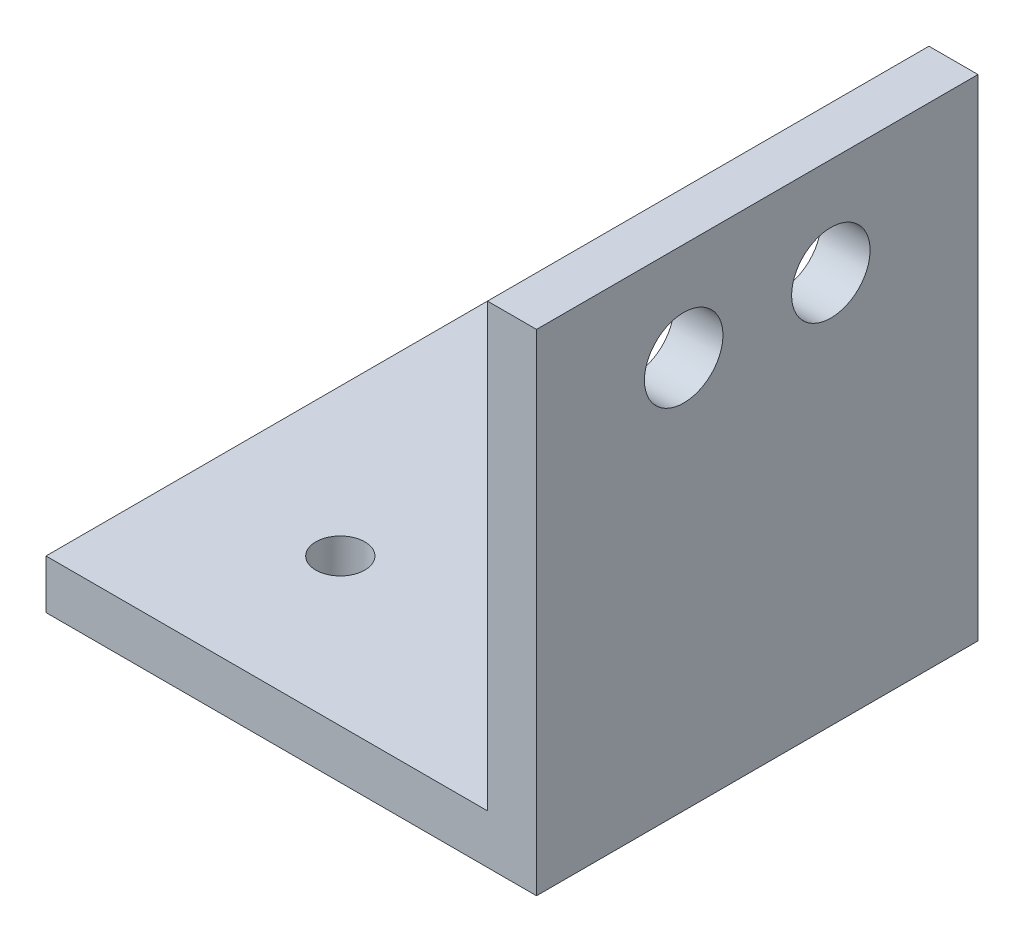
ISO-10303-21;
HEADER;
FILE_DESCRIPTION(('STEP AP214'),'2;1');
FILE_NAME('part.step','',(''),(''),'','','');
FILE_SCHEMA(('AUTOMOTIVE_DESIGN { 1 0 10303 214 1 1 1 1 }'));
ENDSEC;
DATA;
#1=APPLICATION_CONTEXT('core data for automotive mechanical design processes');
#2=APPLICATION_PROTOCOL_DEFINITION('international standard','automotive_design',2000,#1);
#3=PRODUCT_CONTEXT('',#1,'mechanical');
#4=PRODUCT('Part','Part','',(#3));
#5=PRODUCT_RELATED_PRODUCT_CATEGORY('part','',(#4));
#6=PRODUCT_DEFINITION_FORMATION('','',#4);
#7=PRODUCT_DEFINITION_CONTEXT('part definition',#1,'design');
#8=PRODUCT_DEFINITION('design','',#6,#7);
#9=PRODUCT_DEFINITION_SHAPE('','',#8);
#10=(LENGTH_UNIT() NAMED_UNIT(*) SI_UNIT(.MILLI.,.METRE.));
#11=(NAMED_UNIT(*) PLANE_ANGLE_UNIT() SI_UNIT($,.RADIAN.));
#12=(NAMED_UNIT(*) SI_UNIT($,.STERADIAN.) SOLID_ANGLE_UNIT());
#13=UNCERTAINTY_MEASURE_WITH_UNIT(LENGTH_MEASURE(1.E-05),#10,'distance_accuracy_value','');
#14=(GEOMETRIC_REPRESENTATION_CONTEXT(3) GLOBAL_UNCERTAINTY_ASSIGNED_CONTEXT((#13)) GLOBAL_UNIT_ASSIGNED_CONTEXT((#10,
#11,#12)) REPRESENTATION_CONTEXT('',''));
#15=CARTESIAN_POINT('',(0.,0.,0.));
#16=DIRECTION('',(0.,0.,1.));
#17=DIRECTION('',(1.,0.,0.));
#18=AXIS2_PLACEMENT_3D('',#15,#16,#17);
#19=CARTESIAN_POINT('',(-50.,0.,45.));
#20=DIRECTION('',(0.,1.,0.));
#21=DIRECTION('',(0.,0.,1.));
#22=AXIS2_PLACEMENT_3D('',#19,#20,#21);
#23=PLANE('',#22);
#24=CARTESIAN_POINT('',(-35.,0.,30.));
#25=DIRECTION('',(0.,1.,0.));
#26=DIRECTION('',(0.,0.,1.));
#27=AXIS2_PLACEMENT_3D('',#24,#25,#26);
#28=CIRCLE('',#27,2.5);
#29=CARTESIAN_POINT('',(-35.,0.,32.5));
#30=VERTEX_POINT('',#29);
#31=EDGE_CURVE('E163',#30,#30,#28,.T.);
#32=ORIENTED_EDGE('',*,*,#31,.T.);
#33=EDGE_LOOP('',(#32));
#34=FACE_BOUND('',#33,.T.);
#35=CARTESIAN_POINT('',(-20.,0.,15.));
#36=DIRECTION('',(0.,1.,0.));
#37=DIRECTION('',(0.,0.,1.));
#38=AXIS2_PLACEMENT_3D('',#35,#36,#37);
#39=CIRCLE('',#38,2.5);
#40=CARTESIAN_POINT('',(-20.,0.,17.5));
#41=VERTEX_POINT('',#40);
#42=EDGE_CURVE('E171',#41,#41,#39,.T.);
#43=ORIENTED_EDGE('',*,*,#42,.T.);
#44=EDGE_LOOP('',(#43));
#45=FACE_BOUND('',#44,.T.);
#46=DIRECTION('',(1.,0.,0.));
#47=VECTOR('',#46,1.);
#48=CARTESIAN_POINT('',(-50.,0.,0.));
#49=LINE('',#48,#47);
#50=CARTESIAN_POINT('',(-50.,0.,0.));
#51=VERTEX_POINT('',#50);
#52=CARTESIAN_POINT('',(0.,0.,0.));
#53=VERTEX_POINT('',#52);
#54=EDGE_CURVE('E134',#51,#53,#49,.T.);
#55=ORIENTED_EDGE('',*,*,#54,.T.);
#56=DIRECTION('',(0.,0.,-1.));
#57=VECTOR('',#56,1.);
#58=CARTESIAN_POINT('',(0.,0.,45.));
#59=LINE('',#58,#57);
#60=CARTESIAN_POINT('',(0.,0.,45.));
#61=VERTEX_POINT('',#60);
#62=EDGE_CURVE('E11',#61,#53,#59,.T.);
#63=ORIENTED_EDGE('',*,*,#62,.F.);
#64=DIRECTION('',(1.,0.,0.));
#65=VECTOR('',#64,1.);
#66=CARTESIAN_POINT('',(-50.,0.,45.));
#67=LINE('',#66,#65);
#68=CARTESIAN_POINT('',(-50.,0.,45.));
#69=VERTEX_POINT('',#68);
#70=EDGE_CURVE('E151',#69,#61,#67,.T.);
#71=ORIENTED_EDGE('',*,*,#70,.F.);
#72=DIRECTION('',(0.,0.,-1.));
#73=VECTOR('',#72,1.);
#74=CARTESIAN_POINT('',(-50.,0.,45.));
#75=LINE('',#74,#73);
#76=EDGE_CURVE('E130',#69,#51,#75,.T.);
#77=ORIENTED_EDGE('',*,*,#76,.T.);
#78=EDGE_LOOP('',(#55,#63,#71,#77));
#79=FACE_BOUND('',#78,.T.);
#80=ADVANCED_FACE('F43',(#34,#45,#79),#23,.F.);
#81=CARTESIAN_POINT('',(0.,0.,45.));
#82=DIRECTION('',(-1.,0.,0.));
#83=DIRECTION('',(0.,0.,1.));
#84=AXIS2_PLACEMENT_3D('',#81,#82,#83);
#85=PLANE('',#84);
#86=CARTESIAN_POINT('',(0.,40.,15.));
#87=DIRECTION('',(-1.,0.,0.));
#88=DIRECTION('',(0.,0.,1.));
#89=AXIS2_PLACEMENT_3D('',#86,#87,#88);
#90=CIRCLE('',#89,4.);
#91=CARTESIAN_POINT('',(0.,40.,19.));
#92=VERTEX_POINT('',#91);
#93=EDGE_CURVE('E139',#92,#92,#90,.T.);
#94=ORIENTED_EDGE('',*,*,#93,.T.);
#95=EDGE_LOOP('',(#94));
#96=FACE_BOUND('',#95,.T.);
#97=CARTESIAN_POINT('',(0.,40.,30.));
#98=DIRECTION('',(-1.,0.,0.));
#99=DIRECTION('',(0.,0.,1.));
#100=AXIS2_PLACEMENT_3D('',#97,#98,#99);
#101=CIRCLE('',#100,4.00000000000001);
#102=CARTESIAN_POINT('',(0.,40.,34.));
#103=VERTEX_POINT('',#102);
#104=EDGE_CURVE('E169',#103,#103,#101,.T.);
#105=ORIENTED_EDGE('',*,*,#104,.T.);
#106=EDGE_LOOP('',(#105));
#107=FACE_BOUND('',#106,.T.);
#108=DIRECTION('',(0.,1.,0.));
#109=VECTOR('',#108,1.);
#110=CARTESIAN_POINT('',(0.,0.,0.));
#111=LINE('',#110,#109);
#112=CARTESIAN_POINT('',(0.,50.,0.));
#113=VERTEX_POINT('',#112);
#114=EDGE_CURVE('E138',#53,#113,#111,.T.);
#115=ORIENTED_EDGE('',*,*,#114,.T.);
#116=DIRECTION('',(0.,0.,-1.));
#117=VECTOR('',#116,1.);
#118=CARTESIAN_POINT('',(0.,50.,45.));
#119=LINE('',#118,#117);
#120=CARTESIAN_POINT('',(0.,50.,45.));
#121=VERTEX_POINT('',#120);
#122=EDGE_CURVE('E53',#121,#113,#119,.T.);
#123=ORIENTED_EDGE('',*,*,#122,.F.);
#124=DIRECTION('',(0.,1.,0.));
#125=VECTOR('',#124,1.);
#126=CARTESIAN_POINT('',(0.,0.,45.));
#127=LINE('',#126,#125);
#128=EDGE_CURVE('E99',#61,#121,#127,.T.);
#129=ORIENTED_EDGE('',*,*,#128,.F.);
#130=ORIENTED_EDGE('',*,*,#62,.T.);
#131=EDGE_LOOP('',(#115,#123,#129,#130));
#132=FACE_BOUND('',#131,.T.);
#133=ADVANCED_FACE('F199',(#96,#107,#132),#85,.F.);
#134=CARTESIAN_POINT('',(0.,50.,45.));
#135=DIRECTION('',(0.,-1.,0.));
#136=DIRECTION('',(0.,0.,-1.));
#137=AXIS2_PLACEMENT_3D('',#134,#135,#136);
#138=PLANE('',#137);
#139=DIRECTION('',(-1.,0.,0.));
#140=VECTOR('',#139,1.);
#141=CARTESIAN_POINT('',(0.,50.,0.));
#142=LINE('',#141,#140);
#143=CARTESIAN_POINT('',(-5.,50.,0.));
#144=VERTEX_POINT('',#143);
#145=EDGE_CURVE('E142',#113,#144,#142,.T.);
#146=ORIENTED_EDGE('',*,*,#145,.T.);
#147=DIRECTION('',(0.,0.,-1.));
#148=VECTOR('',#147,1.);
#149=CARTESIAN_POINT('',(-5.,50.,45.));
#150=LINE('',#149,#148);
#151=CARTESIAN_POINT('',(-5.,50.,45.));
#152=VERTEX_POINT('',#151);
#153=EDGE_CURVE('E123',#152,#144,#150,.T.);
#154=ORIENTED_EDGE('',*,*,#153,.F.);
#155=DIRECTION('',(-1.,0.,0.));
#156=VECTOR('',#155,1.);
#157=CARTESIAN_POINT('',(0.,50.,45.));
#158=LINE('',#157,#156);
#159=EDGE_CURVE('E112',#121,#152,#158,.T.);
#160=ORIENTED_EDGE('',*,*,#159,.F.);
#161=ORIENTED_EDGE('',*,*,#122,.T.);
#162=EDGE_LOOP('',(#146,#154,#160,#161));
#163=FACE_BOUND('',#162,.T.);
#164=ADVANCED_FACE('F202',(#163),#138,.F.);
#165=CARTESIAN_POINT('',(-5.,50.,45.));
#166=DIRECTION('',(1.,0.,0.));
#167=DIRECTION('',(0.,0.,-1.));
#168=AXIS2_PLACEMENT_3D('',#165,#166,#167);
#169=PLANE('',#168);
#170=CARTESIAN_POINT('',(-5.,40.,15.));
#171=DIRECTION('',(-1.,0.,0.));
#172=DIRECTION('',(0.,0.,1.));
#173=AXIS2_PLACEMENT_3D('',#170,#171,#172);
#174=CIRCLE('',#173,4.);
#175=CARTESIAN_POINT('',(-5.,40.,19.));
#176=VERTEX_POINT('',#175);
#177=EDGE_CURVE('E182',#176,#176,#174,.T.);
#178=ORIENTED_EDGE('',*,*,#177,.F.);
#179=EDGE_LOOP('',(#178));
#180=FACE_BOUND('',#179,.T.);
#181=CARTESIAN_POINT('',(-5.,40.,30.));
#182=DIRECTION('',(-1.,0.,0.));
#183=DIRECTION('',(0.,0.,1.));
#184=AXIS2_PLACEMENT_3D('',#181,#182,#183);
#185=CIRCLE('',#184,4.00000000000001);
#186=CARTESIAN_POINT('',(-5.,40.,34.));
#187=VERTEX_POINT('',#186);
#188=EDGE_CURVE('E186',#187,#187,#185,.T.);
#189=ORIENTED_EDGE('',*,*,#188,.F.);
#190=EDGE_LOOP('',(#189));
#191=FACE_BOUND('',#190,.T.);
#192=DIRECTION('',(0.,-1.,0.));
#193=VECTOR('',#192,1.);
#194=CARTESIAN_POINT('',(-5.,50.,0.));
#195=LINE('',#194,#193);
#196=CARTESIAN_POINT('',(-5.,5.,0.));
#197=VERTEX_POINT('',#196);
#198=EDGE_CURVE('E121',#144,#197,#195,.T.);
#199=ORIENTED_EDGE('',*,*,#198,.T.);
#200=DIRECTION('',(0.,0.,-1.));
#201=VECTOR('',#200,1.);
#202=CARTESIAN_POINT('',(-5.,5.,45.));
#203=LINE('',#202,#201);
#204=CARTESIAN_POINT('',(-5.,5.,45.));
#205=VERTEX_POINT('',#204);
#206=EDGE_CURVE('E118',#205,#197,#203,.T.);
#207=ORIENTED_EDGE('',*,*,#206,.F.);
#208=DIRECTION('',(0.,-1.,0.));
#209=VECTOR('',#208,1.);
#210=CARTESIAN_POINT('',(-5.,50.,45.));
#211=LINE('',#210,#209);
#212=EDGE_CURVE('E106',#152,#205,#211,.T.);
#213=ORIENTED_EDGE('',*,*,#212,.F.);
#214=ORIENTED_EDGE('',*,*,#153,.T.);
#215=EDGE_LOOP('',(#199,#207,#213,#214));
#216=FACE_BOUND('',#215,.T.);
#217=ADVANCED_FACE('F119',(#180,#191,#216),#169,.F.);
#218=CARTESIAN_POINT('',(-5.,5.,45.));
#219=DIRECTION('',(0.,-1.,0.));
#220=DIRECTION('',(1.,0.,0.));
#221=AXIS2_PLACEMENT_3D('',#218,#219,#220);
#222=PLANE('',#221);
#223=CARTESIAN_POINT('',(-35.,5.,30.));
#224=DIRECTION('',(0.,-1.,0.));
#225=DIRECTION('',(1.,0.,0.));
#226=AXIS2_PLACEMENT_3D('',#223,#224,#225);
#227=CIRCLE('',#226,2.5);
#228=CARTESIAN_POINT('',(-32.5,5.,30.));
#229=VERTEX_POINT('',#228);
#230=EDGE_CURVE('E46',#229,#229,#227,.F.);
#231=ORIENTED_EDGE('',*,*,#230,.F.);
#232=EDGE_LOOP('',(#231));
#233=FACE_BOUND('',#232,.T.);
#234=CARTESIAN_POINT('',(-20.,5.,15.));
#235=DIRECTION('',(0.,-1.,0.));
#236=DIRECTION('',(1.,0.,0.));
#237=AXIS2_PLACEMENT_3D('',#234,#235,#236);
#238=CIRCLE('',#237,2.5);
#239=CARTESIAN_POINT('',(-17.5,5.,15.));
#240=VERTEX_POINT('',#239);
#241=EDGE_CURVE('E160',#240,#240,#238,.F.);
#242=ORIENTED_EDGE('',*,*,#241,.F.);
#243=EDGE_LOOP('',(#242));
#244=FACE_BOUND('',#243,.T.);
#245=DIRECTION('',(-1.,0.,0.));
#246=VECTOR('',#245,1.);
#247=CARTESIAN_POINT('',(-5.,5.,0.));
#248=LINE('',#247,#246);
#249=CARTESIAN_POINT('',(-50.,5.,0.));
#250=VERTEX_POINT('',#249);
#251=EDGE_CURVE('E85',#197,#250,#248,.T.);
#252=ORIENTED_EDGE('',*,*,#251,.T.);
#253=DIRECTION('',(0.,0.,-1.));
#254=VECTOR('',#253,1.);
#255=CARTESIAN_POINT('',(-50.,5.,45.));
#256=LINE('',#255,#254);
#257=CARTESIAN_POINT('',(-50.,5.,45.));
#258=VERTEX_POINT('',#257);
#259=EDGE_CURVE('E124',#258,#250,#256,.T.);
#260=ORIENTED_EDGE('',*,*,#259,.F.);
#261=DIRECTION('',(-1.,0.,0.));
#262=VECTOR('',#261,1.);
#263=CARTESIAN_POINT('',(-5.,5.,45.));
#264=LINE('',#263,#262);
#265=EDGE_CURVE('E110',#205,#258,#264,.T.);
#266=ORIENTED_EDGE('',*,*,#265,.F.);
#267=ORIENTED_EDGE('',*,*,#206,.T.);
#268=EDGE_LOOP('',(#252,#260,#266,#267));
#269=FACE_BOUND('',#268,.T.);
#270=ADVANCED_FACE('F126',(#233,#244,#269),#222,.F.);
#271=CARTESIAN_POINT('',(-50.,5.,45.));
#272=DIRECTION('',(1.,0.,0.));
#273=DIRECTION('',(0.,0.,-1.));
#274=AXIS2_PLACEMENT_3D('',#271,#272,#273);
#275=PLANE('',#274);
#276=DIRECTION('',(0.,-1.,0.));
#277=VECTOR('',#276,1.);
#278=CARTESIAN_POINT('',(-50.,5.,0.));
#279=LINE('',#278,#277);
#280=EDGE_CURVE('E91',#250,#51,#279,.T.);
#281=ORIENTED_EDGE('',*,*,#280,.T.);
#282=ORIENTED_EDGE('',*,*,#76,.F.);
#283=DIRECTION('',(0.,-1.,0.));
#284=VECTOR('',#283,1.);
#285=CARTESIAN_POINT('',(-50.,5.,45.));
#286=LINE('',#285,#284);
#287=EDGE_CURVE('E62',#258,#69,#286,.T.);
#288=ORIENTED_EDGE('',*,*,#287,.F.);
#289=ORIENTED_EDGE('',*,*,#259,.T.);
#290=EDGE_LOOP('',(#281,#282,#288,#289));
#291=FACE_BOUND('',#290,.T.);
#292=ADVANCED_FACE('F207',(#291),#275,.F.);
#293=CARTESIAN_POINT('',(0.,0.,45.));
#294=DIRECTION('',(0.,0.,1.));
#295=DIRECTION('',(1.,0.,0.));
#296=AXIS2_PLACEMENT_3D('',#293,#294,#295);
#297=PLANE('',#296);
#298=ORIENTED_EDGE('',*,*,#70,.T.);
#299=ORIENTED_EDGE('',*,*,#128,.T.);
#300=ORIENTED_EDGE('',*,*,#159,.T.);
#301=ORIENTED_EDGE('',*,*,#212,.T.);
#302=ORIENTED_EDGE('',*,*,#265,.T.);
#303=ORIENTED_EDGE('',*,*,#287,.T.);
#304=EDGE_LOOP('',(#298,#299,#300,#301,#302,#303));
#305=FACE_BOUND('',#304,.T.);
#306=ADVANCED_FACE('F108',(#305),#297,.T.);
#307=CARTESIAN_POINT('',(0.,0.,0.));
#308=DIRECTION('',(0.,0.,1.));
#309=DIRECTION('',(1.,0.,0.));
#310=AXIS2_PLACEMENT_3D('',#307,#308,#309);
#311=PLANE('',#310);
#312=ORIENTED_EDGE('',*,*,#54,.F.);
#313=ORIENTED_EDGE('',*,*,#280,.F.);
#314=ORIENTED_EDGE('',*,*,#251,.F.);
#315=ORIENTED_EDGE('',*,*,#198,.F.);
#316=ORIENTED_EDGE('',*,*,#145,.F.);
#317=ORIENTED_EDGE('',*,*,#114,.F.);
#318=EDGE_LOOP('',(#312,#313,#314,#315,#316,#317));
#319=FACE_BOUND('',#318,.T.);
#320=ADVANCED_FACE('F205',(#319),#311,.F.);
#321=CARTESIAN_POINT('',(0.,40.,30.));
#322=DIRECTION('',(-1.,0.,0.));
#323=DIRECTION('',(0.,0.,1.));
#324=AXIS2_PLACEMENT_3D('',#321,#322,#323);
#325=CYLINDRICAL_SURFACE('',#324,4.00000000000001);
#326=ORIENTED_EDGE('',*,*,#104,.F.);
#327=EDGE_LOOP('',(#326));
#328=FACE_BOUND('',#327,.T.);
#329=ORIENTED_EDGE('',*,*,#188,.T.);
#330=EDGE_LOOP('',(#329));
#331=FACE_BOUND('',#330,.T.);
#332=ADVANCED_FACE('F237',(#328,#331),#325,.F.);
#333=CARTESIAN_POINT('',(0.,40.,15.));
#334=DIRECTION('',(-1.,0.,0.));
#335=DIRECTION('',(0.,0.,1.));
#336=AXIS2_PLACEMENT_3D('',#333,#334,#335);
#337=CYLINDRICAL_SURFACE('',#336,4.);
#338=ORIENTED_EDGE('',*,*,#93,.F.);
#339=EDGE_LOOP('',(#338));
#340=FACE_BOUND('',#339,.T.);
#341=ORIENTED_EDGE('',*,*,#177,.T.);
#342=EDGE_LOOP('',(#341));
#343=FACE_BOUND('',#342,.T.);
#344=ADVANCED_FACE('F229',(#340,#343),#337,.F.);
#345=CARTESIAN_POINT('',(-20.,50.,15.));
#346=DIRECTION('',(0.,-1.,0.));
#347=DIRECTION('',(0.,0.,-1.));
#348=AXIS2_PLACEMENT_3D('',#345,#346,#347);
#349=CYLINDRICAL_SURFACE('',#348,2.5);
#350=ORIENTED_EDGE('',*,*,#42,.F.);
#351=EDGE_LOOP('',(#350));
#352=FACE_BOUND('',#351,.T.);
#353=ORIENTED_EDGE('',*,*,#241,.T.);
#354=EDGE_LOOP('',(#353));
#355=FACE_BOUND('',#354,.T.);
#356=ADVANCED_FACE('F226',(#352,#355),#349,.F.);
#357=CARTESIAN_POINT('',(-35.,50.,30.));
#358=DIRECTION('',(0.,-1.,0.));
#359=DIRECTION('',(0.,0.,-1.));
#360=AXIS2_PLACEMENT_3D('',#357,#358,#359);
#361=CYLINDRICAL_SURFACE('',#360,2.5);
#362=ORIENTED_EDGE('',*,*,#31,.F.);
#363=EDGE_LOOP('',(#362));
#364=FACE_BOUND('',#363,.T.);
#365=ORIENTED_EDGE('',*,*,#230,.T.);
#366=EDGE_LOOP('',(#365));
#367=FACE_BOUND('',#366,.T.);
#368=ADVANCED_FACE('F228',(#364,#367),#361,.F.);
#369=CLOSED_SHELL('',(#80,#133,#164,#217,#270,#292,#306,#320,#332,#344,#356,#368));
#370=MANIFOLD_SOLID_BREP('B2',#369);
#371=ADVANCED_BREP_SHAPE_REPRESENTATION('',(#18,#370),#14);
#372=SHAPE_DEFINITION_REPRESENTATION(#9,#371);
ENDSEC;
END-ISO-10303-21;
